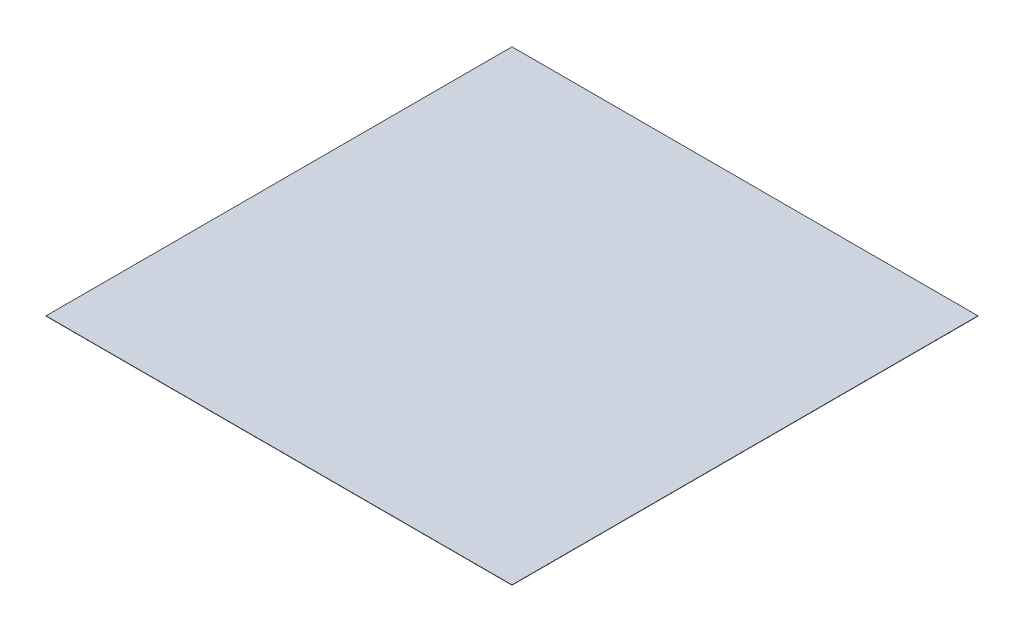
ISO-10303-21;
HEADER;
FILE_DESCRIPTION(('STEP AP214'),'2;1');
FILE_NAME('part.step','',(''),(''),'','','');
FILE_SCHEMA(('AUTOMOTIVE_DESIGN { 1 0 10303 214 1 1 1 1 }'));
ENDSEC;
DATA;
#1=APPLICATION_CONTEXT('core data for automotive mechanical design processes');
#2=APPLICATION_PROTOCOL_DEFINITION('international standard','automotive_design',2000,#1);
#3=PRODUCT_CONTEXT('',#1,'mechanical');
#4=PRODUCT('Part','Part','',(#3));
#5=PRODUCT_RELATED_PRODUCT_CATEGORY('part','',(#4));
#6=PRODUCT_DEFINITION_FORMATION('','',#4);
#7=PRODUCT_DEFINITION_CONTEXT('part definition',#1,'design');
#8=PRODUCT_DEFINITION('design','',#6,#7);
#9=PRODUCT_DEFINITION_SHAPE('','',#8);
#10=(LENGTH_UNIT() NAMED_UNIT(*) SI_UNIT(.MILLI.,.METRE.));
#11=(NAMED_UNIT(*) PLANE_ANGLE_UNIT() SI_UNIT($,.RADIAN.));
#12=(NAMED_UNIT(*) SI_UNIT($,.STERADIAN.) SOLID_ANGLE_UNIT());
#13=UNCERTAINTY_MEASURE_WITH_UNIT(LENGTH_MEASURE(1.E-05),#10,'distance_accuracy_value','');
#14=(GEOMETRIC_REPRESENTATION_CONTEXT(3) GLOBAL_UNCERTAINTY_ASSIGNED_CONTEXT((#13)) GLOBAL_UNIT_ASSIGNED_CONTEXT((#10,
#11,#12)) REPRESENTATION_CONTEXT('',''));
#15=CARTESIAN_POINT('',(0.,0.,0.));
#16=DIRECTION('',(0.,0.,1.));
#17=DIRECTION('',(1.,0.,0.));
#18=AXIS2_PLACEMENT_3D('',#15,#16,#17);
#19=CARTESIAN_POINT('',(-85.,0.1,85.));
#20=DIRECTION('',(1.,0.,0.));
#21=DIRECTION('',(0.,0.,-1.));
#22=AXIS2_PLACEMENT_3D('',#19,#20,#21);
#23=PLANE('',#22);
#24=DIRECTION('',(0.,0.,1.));
#25=VECTOR('',#24,1.);
#26=CARTESIAN_POINT('',(-85.,0.,85.));
#27=LINE('',#26,#25);
#28=CARTESIAN_POINT('',(-85.,0.,-85.));
#29=VERTEX_POINT('',#28);
#30=CARTESIAN_POINT('',(-85.,0.,85.));
#31=VERTEX_POINT('',#30);
#32=EDGE_CURVE('E96',#29,#31,#27,.T.);
#33=ORIENTED_EDGE('',*,*,#32,.T.);
#34=DIRECTION('',(0.,-1.,0.));
#35=VECTOR('',#34,1.);
#36=CARTESIAN_POINT('',(-85.,0.1,85.));
#37=LINE('',#36,#35);
#38=CARTESIAN_POINT('',(-85.,0.1,85.));
#39=VERTEX_POINT('',#38);
#40=EDGE_CURVE('E11',#39,#31,#37,.T.);
#41=ORIENTED_EDGE('',*,*,#40,.F.);
#42=DIRECTION('',(0.,0.,1.));
#43=VECTOR('',#42,1.);
#44=CARTESIAN_POINT('',(-85.,0.1,85.));
#45=LINE('',#44,#43);
#46=CARTESIAN_POINT('',(-85.,0.1,-85.));
#47=VERTEX_POINT('',#46);
#48=EDGE_CURVE('E84',#47,#39,#45,.T.);
#49=ORIENTED_EDGE('',*,*,#48,.F.);
#50=DIRECTION('',(0.,-1.,0.));
#51=VECTOR('',#50,1.);
#52=CARTESIAN_POINT('',(-85.,0.1,-85.));
#53=LINE('',#52,#51);
#54=EDGE_CURVE('E92',#47,#29,#53,.T.);
#55=ORIENTED_EDGE('',*,*,#54,.T.);
#56=EDGE_LOOP('',(#33,#41,#49,#55));
#57=FACE_BOUND('',#56,.T.);
#58=ADVANCED_FACE('F33',(#57),#23,.F.);
#59=CARTESIAN_POINT('',(85.,0.1,85.));
#60=DIRECTION('',(0.,0.,-1.));
#61=DIRECTION('',(-1.,0.,0.));
#62=AXIS2_PLACEMENT_3D('',#59,#60,#61);
#63=PLANE('',#62);
#64=DIRECTION('',(1.,0.,0.));
#65=VECTOR('',#64,1.);
#66=CARTESIAN_POINT('',(85.,0.,85.));
#67=LINE('',#66,#65);
#68=CARTESIAN_POINT('',(85.,0.,85.));
#69=VERTEX_POINT('',#68);
#70=EDGE_CURVE('E88',#31,#69,#67,.T.);
#71=ORIENTED_EDGE('',*,*,#70,.T.);
#72=DIRECTION('',(0.,-1.,0.));
#73=VECTOR('',#72,1.);
#74=CARTESIAN_POINT('',(85.,0.1,85.));
#75=LINE('',#74,#73);
#76=CARTESIAN_POINT('',(85.,0.1,85.));
#77=VERTEX_POINT('',#76);
#78=EDGE_CURVE('E41',#77,#69,#75,.T.);
#79=ORIENTED_EDGE('',*,*,#78,.F.);
#80=DIRECTION('',(1.,0.,0.));
#81=VECTOR('',#80,1.);
#82=CARTESIAN_POINT('',(85.,0.1,85.));
#83=LINE('',#82,#81);
#84=EDGE_CURVE('E79',#39,#77,#83,.T.);
#85=ORIENTED_EDGE('',*,*,#84,.F.);
#86=ORIENTED_EDGE('',*,*,#40,.T.);
#87=EDGE_LOOP('',(#71,#79,#85,#86));
#88=FACE_BOUND('',#87,.T.);
#89=ADVANCED_FACE('F87',(#88),#63,.F.);
#90=CARTESIAN_POINT('',(85.,0.1,85.));
#91=DIRECTION('',(-1.,0.,0.));
#92=DIRECTION('',(0.,0.,1.));
#93=AXIS2_PLACEMENT_3D('',#90,#91,#92);
#94=PLANE('',#93);
#95=DIRECTION('',(0.,0.,-1.));
#96=VECTOR('',#95,1.);
#97=CARTESIAN_POINT('',(85.,0.,85.));
#98=LINE('',#97,#96);
#99=CARTESIAN_POINT('',(85.,0.,-85.));
#100=VERTEX_POINT('',#99);
#101=EDGE_CURVE('E66',#69,#100,#98,.T.);
#102=ORIENTED_EDGE('',*,*,#101,.T.);
#103=DIRECTION('',(0.,-1.,0.));
#104=VECTOR('',#103,1.);
#105=CARTESIAN_POINT('',(85.,0.1,-85.));
#106=LINE('',#105,#104);
#107=CARTESIAN_POINT('',(85.,0.1,-85.));
#108=VERTEX_POINT('',#107);
#109=EDGE_CURVE('E89',#108,#100,#106,.T.);
#110=ORIENTED_EDGE('',*,*,#109,.F.);
#111=DIRECTION('',(0.,0.,-1.));
#112=VECTOR('',#111,1.);
#113=CARTESIAN_POINT('',(85.,0.1,85.));
#114=LINE('',#113,#112);
#115=EDGE_CURVE('E82',#77,#108,#114,.T.);
#116=ORIENTED_EDGE('',*,*,#115,.F.);
#117=ORIENTED_EDGE('',*,*,#78,.T.);
#118=EDGE_LOOP('',(#102,#110,#116,#117));
#119=FACE_BOUND('',#118,.T.);
#120=ADVANCED_FACE('F90',(#119),#94,.F.);
#121=CARTESIAN_POINT('',(85.,0.1,-85.));
#122=DIRECTION('',(0.,0.,1.));
#123=DIRECTION('',(1.,0.,0.));
#124=AXIS2_PLACEMENT_3D('',#121,#122,#123);
#125=PLANE('',#124);
#126=DIRECTION('',(-1.,0.,0.));
#127=VECTOR('',#126,1.);
#128=CARTESIAN_POINT('',(85.,0.,-85.));
#129=LINE('',#128,#127);
#130=EDGE_CURVE('E72',#100,#29,#129,.T.);
#131=ORIENTED_EDGE('',*,*,#130,.T.);
#132=ORIENTED_EDGE('',*,*,#54,.F.);
#133=DIRECTION('',(-1.,0.,0.));
#134=VECTOR('',#133,1.);
#135=CARTESIAN_POINT('',(85.,0.1,-85.));
#136=LINE('',#135,#134);
#137=EDGE_CURVE('E49',#108,#47,#136,.T.);
#138=ORIENTED_EDGE('',*,*,#137,.F.);
#139=ORIENTED_EDGE('',*,*,#109,.T.);
#140=EDGE_LOOP('',(#131,#132,#138,#139));
#141=FACE_BOUND('',#140,.T.);
#142=ADVANCED_FACE('F103',(#141),#125,.F.);
#143=CARTESIAN_POINT('',(0.,0.1,0.));
#144=DIRECTION('',(0.,1.,0.));
#145=DIRECTION('',(0.,0.,1.));
#146=AXIS2_PLACEMENT_3D('',#143,#144,#145);
#147=PLANE('',#146);
#148=ORIENTED_EDGE('',*,*,#48,.T.);
#149=ORIENTED_EDGE('',*,*,#84,.T.);
#150=ORIENTED_EDGE('',*,*,#115,.T.);
#151=ORIENTED_EDGE('',*,*,#137,.T.);
#152=EDGE_LOOP('',(#148,#149,#150,#151));
#153=FACE_BOUND('',#152,.T.);
#154=ADVANCED_FACE('F80',(#153),#147,.T.);
#155=CARTESIAN_POINT('',(0.,0.,0.));
#156=DIRECTION('',(0.,1.,0.));
#157=DIRECTION('',(0.,0.,1.));
#158=AXIS2_PLACEMENT_3D('',#155,#156,#157);
#159=PLANE('',#158);
#160=ORIENTED_EDGE('',*,*,#32,.F.);
#161=ORIENTED_EDGE('',*,*,#130,.F.);
#162=ORIENTED_EDGE('',*,*,#101,.F.);
#163=ORIENTED_EDGE('',*,*,#70,.F.);
#164=EDGE_LOOP('',(#160,#161,#162,#163));
#165=FACE_BOUND('',#164,.T.);
#166=ADVANCED_FACE('F106',(#165),#159,.F.);
#167=CLOSED_SHELL('',(#58,#89,#120,#142,#154,#166));
#168=MANIFOLD_SOLID_BREP('B2',#167);
#169=ADVANCED_BREP_SHAPE_REPRESENTATION('',(#18,#168),#14);
#170=SHAPE_DEFINITION_REPRESENTATION(#9,#169);
ENDSEC;
END-ISO-10303-21;
